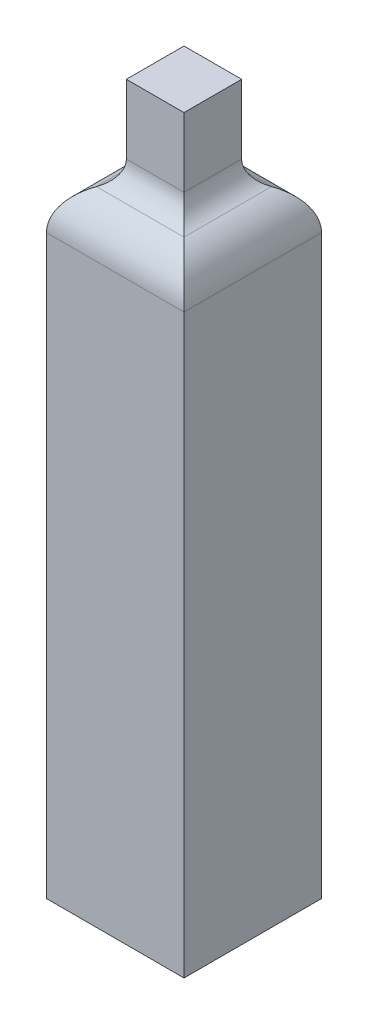
ISO-10303-21;
HEADER;
FILE_DESCRIPTION(('STEP AP214'),'2;1');
FILE_NAME('part.step','',(''),(''),'','','');
FILE_SCHEMA(('AUTOMOTIVE_DESIGN { 1 0 10303 214 1 1 1 1 }'));
ENDSEC;
DATA;
#1=APPLICATION_CONTEXT('core data for automotive mechanical design processes');
#2=APPLICATION_PROTOCOL_DEFINITION('international standard','automotive_design',2000,#1);
#3=PRODUCT_CONTEXT('',#1,'mechanical');
#4=PRODUCT('Part','Part','',(#3));
#5=PRODUCT_RELATED_PRODUCT_CATEGORY('part','',(#4));
#6=PRODUCT_DEFINITION_FORMATION('','',#4);
#7=PRODUCT_DEFINITION_CONTEXT('part definition',#1,'design');
#8=PRODUCT_DEFINITION('design','',#6,#7);
#9=PRODUCT_DEFINITION_SHAPE('','',#8);
#10=(LENGTH_UNIT() NAMED_UNIT(*) SI_UNIT(.MILLI.,.METRE.));
#11=(NAMED_UNIT(*) PLANE_ANGLE_UNIT() SI_UNIT($,.RADIAN.));
#12=(NAMED_UNIT(*) SI_UNIT($,.STERADIAN.) SOLID_ANGLE_UNIT());
#13=UNCERTAINTY_MEASURE_WITH_UNIT(LENGTH_MEASURE(1.E-05),#10,'distance_accuracy_value','');
#14=(GEOMETRIC_REPRESENTATION_CONTEXT(3) GLOBAL_UNCERTAINTY_ASSIGNED_CONTEXT((#13)) GLOBAL_UNIT_ASSIGNED_CONTEXT((#10,
#11,#12)) REPRESENTATION_CONTEXT('',''));
#15=CARTESIAN_POINT('',(0.,0.,0.));
#16=DIRECTION('',(0.,0.,1.));
#17=DIRECTION('',(1.,0.,0.));
#18=AXIS2_PLACEMENT_3D('',#15,#16,#17);
#19=CARTESIAN_POINT('',(7.75,70.,-7.75));
#20=DIRECTION('',(-1.,0.,0.));
#21=DIRECTION('',(0.,0.,1.));
#22=AXIS2_PLACEMENT_3D('',#19,#20,#21);
#23=PLANE('',#22);
#24=DIRECTION('',(0.,-1.,0.));
#25=VECTOR('',#24,1.);
#26=CARTESIAN_POINT('',(7.75,70.,-7.75));
#27=LINE('',#26,#25);
#28=CARTESIAN_POINT('',(7.75,65.0250628144669,-7.75));
#29=VERTEX_POINT('',#28);
#30=CARTESIAN_POINT('',(7.75,0.,-7.75));
#31=VERTEX_POINT('',#30);
#32=EDGE_CURVE('E160',#29,#31,#27,.T.);
#33=ORIENTED_EDGE('',*,*,#32,.F.);
#34=DIRECTION('',(0.,0.,1.));
#35=VECTOR('',#34,1.);
#36=CARTESIAN_POINT('',(7.75,65.0250628144669,-7.75));
#37=LINE('',#36,#35);
#38=CARTESIAN_POINT('',(7.75,65.0250628144669,7.75));
#39=VERTEX_POINT('',#38);
#40=EDGE_CURVE('E165',#29,#39,#37,.T.);
#41=ORIENTED_EDGE('',*,*,#40,.T.);
#42=DIRECTION('',(0.,-1.,0.));
#43=VECTOR('',#42,1.);
#44=CARTESIAN_POINT('',(7.75,70.,7.75));
#45=LINE('',#44,#43);
#46=CARTESIAN_POINT('',(7.75,0.,7.75));
#47=VERTEX_POINT('',#46);
#48=EDGE_CURVE('E154',#39,#47,#45,.T.);
#49=ORIENTED_EDGE('',*,*,#48,.T.);
#50=DIRECTION('',(0.,0.,-1.));
#51=VECTOR('',#50,1.);
#52=CARTESIAN_POINT('',(7.75,0.,-7.75));
#53=LINE('',#52,#51);
#54=EDGE_CURVE('E137',#47,#31,#53,.T.);
#55=ORIENTED_EDGE('',*,*,#54,.T.);
#56=EDGE_LOOP('',(#33,#41,#49,#55));
#57=FACE_BOUND('',#56,.T.);
#58=ADVANCED_FACE('F35',(#57),#23,.F.);
#59=CARTESIAN_POINT('',(-7.75,70.,-7.75));
#60=DIRECTION('',(0.,0.,1.));
#61=DIRECTION('',(1.,0.,0.));
#62=AXIS2_PLACEMENT_3D('',#59,#60,#61);
#63=PLANE('',#62);
#64=DIRECTION('',(0.,-1.,0.));
#65=VECTOR('',#64,1.);
#66=CARTESIAN_POINT('',(-7.75,70.,-7.75));
#67=LINE('',#66,#65);
#68=CARTESIAN_POINT('',(-7.75,65.0250628144669,-7.75));
#69=VERTEX_POINT('',#68);
#70=CARTESIAN_POINT('',(-7.75,0.,-7.75));
#71=VERTEX_POINT('',#70);
#72=EDGE_CURVE('E158',#69,#71,#67,.T.);
#73=ORIENTED_EDGE('',*,*,#72,.F.);
#74=DIRECTION('',(1.,0.,0.));
#75=VECTOR('',#74,1.);
#76=CARTESIAN_POINT('',(-7.75,65.0250628144669,-7.75));
#77=LINE('',#76,#75);
#78=EDGE_CURVE('E162',#69,#29,#77,.T.);
#79=ORIENTED_EDGE('',*,*,#78,.T.);
#80=ORIENTED_EDGE('',*,*,#32,.T.);
#81=DIRECTION('',(-1.,0.,0.));
#82=VECTOR('',#81,1.);
#83=CARTESIAN_POINT('',(-7.75,0.,-7.75));
#84=LINE('',#83,#82);
#85=EDGE_CURVE('E140',#31,#71,#84,.T.);
#86=ORIENTED_EDGE('',*,*,#85,.T.);
#87=EDGE_LOOP('',(#73,#79,#80,#86));
#88=FACE_BOUND('',#87,.T.);
#89=ADVANCED_FACE('F241',(#88),#63,.F.);
#90=CARTESIAN_POINT('',(-7.75,70.,-7.75));
#91=DIRECTION('',(1.,0.,0.));
#92=DIRECTION('',(0.,0.,-1.));
#93=AXIS2_PLACEMENT_3D('',#90,#91,#92);
#94=PLANE('',#93);
#95=DIRECTION('',(0.,-1.,0.));
#96=VECTOR('',#95,1.);
#97=CARTESIAN_POINT('',(-7.75,70.,7.75));
#98=LINE('',#97,#96);
#99=CARTESIAN_POINT('',(-7.75,65.0250628144669,7.75));
#100=VERTEX_POINT('',#99);
#101=CARTESIAN_POINT('',(-7.75,0.,7.75));
#102=VERTEX_POINT('',#101);
#103=EDGE_CURVE('E156',#100,#102,#98,.T.);
#104=ORIENTED_EDGE('',*,*,#103,.F.);
#105=DIRECTION('',(0.,0.,-1.));
#106=VECTOR('',#105,1.);
#107=CARTESIAN_POINT('',(-7.75,65.0250628144669,-7.75));
#108=LINE('',#107,#106);
#109=EDGE_CURVE('E168',#100,#69,#108,.T.);
#110=ORIENTED_EDGE('',*,*,#109,.T.);
#111=ORIENTED_EDGE('',*,*,#72,.T.);
#112=DIRECTION('',(0.,0.,1.));
#113=VECTOR('',#112,1.);
#114=CARTESIAN_POINT('',(-7.75,0.,-7.75));
#115=LINE('',#114,#113);
#116=EDGE_CURVE('E148',#71,#102,#115,.T.);
#117=ORIENTED_EDGE('',*,*,#116,.T.);
#118=EDGE_LOOP('',(#104,#110,#111,#117));
#119=FACE_BOUND('',#118,.T.);
#120=ADVANCED_FACE('F247',(#119),#94,.F.);
#121=CARTESIAN_POINT('',(-7.75,70.,7.75));
#122=DIRECTION('',(0.,0.,-1.));
#123=DIRECTION('',(-1.,0.,0.));
#124=AXIS2_PLACEMENT_3D('',#121,#122,#123);
#125=PLANE('',#124);
#126=ORIENTED_EDGE('',*,*,#48,.F.);
#127=DIRECTION('',(-1.,0.,0.));
#128=VECTOR('',#127,1.);
#129=CARTESIAN_POINT('',(-7.75,65.0250628144669,7.75));
#130=LINE('',#129,#128);
#131=EDGE_CURVE('E170',#39,#100,#130,.T.);
#132=ORIENTED_EDGE('',*,*,#131,.T.);
#133=ORIENTED_EDGE('',*,*,#103,.T.);
#134=DIRECTION('',(1.,0.,0.));
#135=VECTOR('',#134,1.);
#136=CARTESIAN_POINT('',(-7.75,0.,7.75));
#137=LINE('',#136,#135);
#138=EDGE_CURVE('E151',#102,#47,#137,.T.);
#139=ORIENTED_EDGE('',*,*,#138,.T.);
#140=EDGE_LOOP('',(#126,#132,#133,#139));
#141=FACE_BOUND('',#140,.T.);
#142=ADVANCED_FACE('F318',(#141),#125,.F.);
#143=CARTESIAN_POINT('',(0.,0.,0.));
#144=DIRECTION('',(0.,1.,0.));
#145=DIRECTION('',(0.,0.,1.));
#146=AXIS2_PLACEMENT_3D('',#143,#144,#145);
#147=PLANE('',#146);
#148=ORIENTED_EDGE('',*,*,#54,.F.);
#149=ORIENTED_EDGE('',*,*,#138,.F.);
#150=ORIENTED_EDGE('',*,*,#116,.F.);
#151=ORIENTED_EDGE('',*,*,#85,.F.);
#152=EDGE_LOOP('',(#148,#149,#150,#151));
#153=FACE_BOUND('',#152,.T.);
#154=ADVANCED_FACE('F299',(#153),#147,.F.);
#155=CARTESIAN_POINT('',(3.25,80.,-3.25));
#156=DIRECTION('',(-1.,0.,0.));
#157=DIRECTION('',(0.,0.,1.));
#158=AXIS2_PLACEMENT_3D('',#155,#156,#157);
#159=PLANE('',#158);
#160=DIRECTION('',(0.,-1.,0.));
#161=VECTOR('',#160,1.);
#162=CARTESIAN_POINT('',(3.25,80.,3.25));
#163=LINE('',#162,#161);
#164=CARTESIAN_POINT('',(3.25,80.,3.25));
#165=VERTEX_POINT('',#164);
#166=CARTESIAN_POINT('',(3.25,72.218810099436,3.25));
#167=VERTEX_POINT('',#166);
#168=EDGE_CURVE('E228',#165,#167,#163,.T.);
#169=ORIENTED_EDGE('',*,*,#168,.T.);
#170=DIRECTION('',(0.,0.,1.));
#171=VECTOR('',#170,1.);
#172=CARTESIAN_POINT('',(3.25,72.218810099436,-3.25));
#173=LINE('',#172,#171);
#174=CARTESIAN_POINT('',(3.25,72.218810099436,-3.25));
#175=VERTEX_POINT('',#174);
#176=EDGE_CURVE('E44',#167,#175,#173,.F.);
#177=ORIENTED_EDGE('',*,*,#176,.T.);
#178=DIRECTION('',(0.,-1.,0.));
#179=VECTOR('',#178,1.);
#180=CARTESIAN_POINT('',(3.25,80.,-3.25));
#181=LINE('',#180,#179);
#182=CARTESIAN_POINT('',(3.25,80.,-3.25));
#183=VERTEX_POINT('',#182);
#184=EDGE_CURVE('E119',#183,#175,#181,.T.);
#185=ORIENTED_EDGE('',*,*,#184,.F.);
#186=DIRECTION('',(0.,0.,-1.));
#187=VECTOR('',#186,1.);
#188=CARTESIAN_POINT('',(3.25,80.,-3.25));
#189=LINE('',#188,#187);
#190=EDGE_CURVE('E126',#165,#183,#189,.T.);
#191=ORIENTED_EDGE('',*,*,#190,.F.);
#192=EDGE_LOOP('',(#169,#177,#185,#191));
#193=FACE_BOUND('',#192,.T.);
#194=ADVANCED_FACE('F135',(#193),#159,.F.);
#195=CARTESIAN_POINT('',(-3.25,80.,-3.25));
#196=DIRECTION('',(0.,0.,1.));
#197=DIRECTION('',(1.,0.,0.));
#198=AXIS2_PLACEMENT_3D('',#195,#196,#197);
#199=PLANE('',#198);
#200=ORIENTED_EDGE('',*,*,#184,.T.);
#201=DIRECTION('',(1.,0.,0.));
#202=VECTOR('',#201,1.);
#203=CARTESIAN_POINT('',(-3.25,72.218810099436,-3.25));
#204=LINE('',#203,#202);
#205=CARTESIAN_POINT('',(-3.25,72.218810099436,-3.25));
#206=VERTEX_POINT('',#205);
#207=EDGE_CURVE('E187',#175,#206,#204,.F.);
#208=ORIENTED_EDGE('',*,*,#207,.T.);
#209=DIRECTION('',(0.,-1.,0.));
#210=VECTOR('',#209,1.);
#211=CARTESIAN_POINT('',(-3.25,80.,-3.25));
#212=LINE('',#211,#210);
#213=CARTESIAN_POINT('',(-3.25,80.,-3.25));
#214=VERTEX_POINT('',#213);
#215=EDGE_CURVE('E122',#214,#206,#212,.T.);
#216=ORIENTED_EDGE('',*,*,#215,.F.);
#217=DIRECTION('',(-1.,0.,0.));
#218=VECTOR('',#217,1.);
#219=CARTESIAN_POINT('',(-3.25,80.,-3.25));
#220=LINE('',#219,#218);
#221=EDGE_CURVE('E115',#183,#214,#220,.T.);
#222=ORIENTED_EDGE('',*,*,#221,.F.);
#223=EDGE_LOOP('',(#200,#208,#216,#222));
#224=FACE_BOUND('',#223,.T.);
#225=ADVANCED_FACE('F117',(#224),#199,.F.);
#226=CARTESIAN_POINT('',(-3.25,80.,-3.25));
#227=DIRECTION('',(1.,0.,0.));
#228=DIRECTION('',(0.,0.,-1.));
#229=AXIS2_PLACEMENT_3D('',#226,#227,#228);
#230=PLANE('',#229);
#231=ORIENTED_EDGE('',*,*,#215,.T.);
#232=DIRECTION('',(0.,0.,-1.));
#233=VECTOR('',#232,1.);
#234=CARTESIAN_POINT('',(-3.25,72.218810099436,-3.25));
#235=LINE('',#234,#233);
#236=CARTESIAN_POINT('',(-3.25,72.218810099436,3.25));
#237=VERTEX_POINT('',#236);
#238=EDGE_CURVE('E172',#206,#237,#235,.F.);
#239=ORIENTED_EDGE('',*,*,#238,.T.);
#240=DIRECTION('',(0.,-1.,0.));
#241=VECTOR('',#240,1.);
#242=CARTESIAN_POINT('',(-3.25,80.,3.25));
#243=LINE('',#242,#241);
#244=CARTESIAN_POINT('',(-3.25,80.,3.25));
#245=VERTEX_POINT('',#244);
#246=EDGE_CURVE('E142',#245,#237,#243,.T.);
#247=ORIENTED_EDGE('',*,*,#246,.F.);
#248=DIRECTION('',(0.,0.,1.));
#249=VECTOR('',#248,1.);
#250=CARTESIAN_POINT('',(-3.25,80.,-3.25));
#251=LINE('',#250,#249);
#252=EDGE_CURVE('E125',#214,#245,#251,.T.);
#253=ORIENTED_EDGE('',*,*,#252,.F.);
#254=EDGE_LOOP('',(#231,#239,#247,#253));
#255=FACE_BOUND('',#254,.T.);
#256=ADVANCED_FACE('F226',(#255),#230,.F.);
#257=CARTESIAN_POINT('',(-3.25,80.,3.25));
#258=DIRECTION('',(0.,0.,-1.));
#259=DIRECTION('',(-1.,0.,0.));
#260=AXIS2_PLACEMENT_3D('',#257,#258,#259);
#261=PLANE('',#260);
#262=ORIENTED_EDGE('',*,*,#246,.T.);
#263=DIRECTION('',(-1.,0.,0.));
#264=VECTOR('',#263,1.);
#265=CARTESIAN_POINT('',(-3.25,72.218810099436,3.25));
#266=LINE('',#265,#264);
#267=EDGE_CURVE('E58',#237,#167,#266,.F.);
#268=ORIENTED_EDGE('',*,*,#267,.T.);
#269=ORIENTED_EDGE('',*,*,#168,.F.);
#270=DIRECTION('',(1.,0.,0.));
#271=VECTOR('',#270,1.);
#272=CARTESIAN_POINT('',(-3.25,80.,3.25));
#273=LINE('',#272,#271);
#274=EDGE_CURVE('E131',#245,#165,#273,.T.);
#275=ORIENTED_EDGE('',*,*,#274,.F.);
#276=EDGE_LOOP('',(#262,#268,#269,#275));
#277=FACE_BOUND('',#276,.T.);
#278=ADVANCED_FACE('F227',(#277),#261,.F.);
#279=CARTESIAN_POINT('',(0.,80.,0.));
#280=DIRECTION('',(0.,1.,0.));
#281=DIRECTION('',(0.,0.,1.));
#282=AXIS2_PLACEMENT_3D('',#279,#280,#281);
#283=PLANE('',#282);
#284=ORIENTED_EDGE('',*,*,#190,.T.);
#285=ORIENTED_EDGE('',*,*,#221,.T.);
#286=ORIENTED_EDGE('',*,*,#252,.T.);
#287=ORIENTED_EDGE('',*,*,#274,.T.);
#288=EDGE_LOOP('',(#284,#285,#286,#287));
#289=FACE_BOUND('',#288,.T.);
#290=ADVANCED_FACE('F129',(#289),#283,.T.);
#291=CARTESIAN_POINT('',(0.,65.0250628144669,2.75));
#292=DIRECTION('',(-1.,0.,0.));
#293=DIRECTION('',(0.,0.,1.));
#294=AXIS2_PLACEMENT_3D('',#291,#292,#293);
#295=CYLINDRICAL_SURFACE('',#294,5.);
#296=CARTESIAN_POINT('',(2.75,65.0250628144669,2.75));
#297=DIRECTION('',(-0.707106781186547,0.,0.707106781186548));
#298=DIRECTION('',(-0.707106781186548,0.,-0.707106781186547));
#299=AXIS2_PLACEMENT_3D('',#296,#297,#298);
#300=ELLIPSE('',#299,7.07106781186548,5.);
#301=CARTESIAN_POINT('',(4.9375,69.5211548675726,4.9375));
#302=VERTEX_POINT('',#301);
#303=EDGE_CURVE('E133',#302,#39,#300,.F.);
#304=ORIENTED_EDGE('',*,*,#303,.F.);
#305=DIRECTION('',(-1.,0.,0.));
#306=VECTOR('',#305,1.);
#307=CARTESIAN_POINT('',(0.,69.5211548675726,4.9375));
#308=LINE('',#307,#306);
#309=CARTESIAN_POINT('',(-4.9375,69.5211548675726,4.9375));
#310=VERTEX_POINT('',#309);
#311=EDGE_CURVE('E192',#302,#310,#308,.T.);
#312=ORIENTED_EDGE('',*,*,#311,.T.);
#313=CARTESIAN_POINT('',(-2.75,65.0250628144669,2.75));
#314=DIRECTION('',(-0.707106781186548,0.,-0.707106781186547));
#315=DIRECTION('',(-0.707106781186547,0.,0.707106781186548));
#316=AXIS2_PLACEMENT_3D('',#313,#314,#315);
#317=ELLIPSE('',#316,7.07106781186547,5.);
#318=EDGE_CURVE('E178',#100,#310,#317,.T.);
#319=ORIENTED_EDGE('',*,*,#318,.F.);
#320=ORIENTED_EDGE('',*,*,#131,.F.);
#321=EDGE_LOOP('',(#304,#312,#319,#320));
#322=FACE_BOUND('',#321,.T.);
#323=ADVANCED_FACE('F214',(#322),#295,.T.);
#324=CARTESIAN_POINT('',(2.75,65.0250628144669,0.));
#325=DIRECTION('',(0.,0.,1.));
#326=DIRECTION('',(1.,0.,0.));
#327=AXIS2_PLACEMENT_3D('',#324,#325,#326);
#328=CYLINDRICAL_SURFACE('',#327,5.);
#329=CARTESIAN_POINT('',(2.75,65.0250628144669,-2.75));
#330=DIRECTION('',(0.707106781186548,0.,0.707106781186547));
#331=DIRECTION('',(-0.707106781186547,0.,0.707106781186548));
#332=AXIS2_PLACEMENT_3D('',#329,#330,#331);
#333=ELLIPSE('',#332,7.07106781186547,5.);
#334=CARTESIAN_POINT('',(4.9375,69.5211548675726,-4.9375));
#335=VERTEX_POINT('',#334);
#336=EDGE_CURVE('E176',#335,#29,#333,.F.);
#337=ORIENTED_EDGE('',*,*,#336,.F.);
#338=DIRECTION('',(0.,0.,1.));
#339=VECTOR('',#338,1.);
#340=CARTESIAN_POINT('',(4.9375,69.5211548675726,0.));
#341=LINE('',#340,#339);
#342=EDGE_CURVE('E11',#335,#302,#341,.T.);
#343=ORIENTED_EDGE('',*,*,#342,.T.);
#344=ORIENTED_EDGE('',*,*,#303,.T.);
#345=ORIENTED_EDGE('',*,*,#40,.F.);
#346=EDGE_LOOP('',(#337,#343,#344,#345));
#347=FACE_BOUND('',#346,.T.);
#348=ADVANCED_FACE('F259',(#347),#328,.T.);
#349=CARTESIAN_POINT('',(-2.75,65.0250628144669,0.));
#350=DIRECTION('',(0.,0.,-1.));
#351=DIRECTION('',(-1.,0.,0.));
#352=AXIS2_PLACEMENT_3D('',#349,#350,#351);
#353=CYLINDRICAL_SURFACE('',#352,5.);
#354=ORIENTED_EDGE('',*,*,#318,.T.);
#355=DIRECTION('',(0.,0.,-1.));
#356=VECTOR('',#355,1.);
#357=CARTESIAN_POINT('',(-4.9375,69.5211548675726,0.));
#358=LINE('',#357,#356);
#359=CARTESIAN_POINT('',(-4.9375,69.5211548675726,-4.9375));
#360=VERTEX_POINT('',#359);
#361=EDGE_CURVE('E184',#310,#360,#358,.T.);
#362=ORIENTED_EDGE('',*,*,#361,.T.);
#363=CARTESIAN_POINT('',(-2.75,65.0250628144669,-2.75));
#364=DIRECTION('',(0.707106781186547,0.,-0.707106781186548));
#365=DIRECTION('',(-0.707106781186548,0.,-0.707106781186547));
#366=AXIS2_PLACEMENT_3D('',#363,#364,#365);
#367=ELLIPSE('',#366,7.07106781186548,5.);
#368=EDGE_CURVE('E173',#69,#360,#367,.T.);
#369=ORIENTED_EDGE('',*,*,#368,.F.);
#370=ORIENTED_EDGE('',*,*,#109,.F.);
#371=EDGE_LOOP('',(#354,#362,#369,#370));
#372=FACE_BOUND('',#371,.T.);
#373=ADVANCED_FACE('F219',(#372),#353,.T.);
#374=CARTESIAN_POINT('',(0.,65.0250628144669,-2.75));
#375=DIRECTION('',(1.,0.,0.));
#376=DIRECTION('',(0.,0.,-1.));
#377=AXIS2_PLACEMENT_3D('',#374,#375,#376);
#378=CYLINDRICAL_SURFACE('',#377,5.);
#379=ORIENTED_EDGE('',*,*,#368,.T.);
#380=DIRECTION('',(1.,0.,0.));
#381=VECTOR('',#380,1.);
#382=CARTESIAN_POINT('',(0.,69.5211548675726,-4.9375));
#383=LINE('',#382,#381);
#384=EDGE_CURVE('E189',#360,#335,#383,.T.);
#385=ORIENTED_EDGE('',*,*,#384,.T.);
#386=ORIENTED_EDGE('',*,*,#336,.T.);
#387=ORIENTED_EDGE('',*,*,#78,.F.);
#388=EDGE_LOOP('',(#379,#385,#386,#387));
#389=FACE_BOUND('',#388,.T.);
#390=ADVANCED_FACE('F253',(#389),#378,.T.);
#391=CARTESIAN_POINT('',(6.25,72.218810099436,0.));
#392=DIRECTION('',(0.,0.,1.));
#393=DIRECTION('',(1.,0.,0.));
#394=AXIS2_PLACEMENT_3D('',#391,#392,#393);
#395=CYLINDRICAL_SURFACE('',#394,3.);
#396=CARTESIAN_POINT('',(6.25,72.218810099436,6.25));
#397=DIRECTION('',(-0.707106781186547,0.,0.707106781186548));
#398=DIRECTION('',(0.707106781186548,0.,0.707106781186547));
#399=AXIS2_PLACEMENT_3D('',#396,#397,#398);
#400=ELLIPSE('',#399,4.24264068711929,3.);
#401=EDGE_CURVE('E198',#302,#167,#400,.F.);
#402=ORIENTED_EDGE('',*,*,#401,.F.);
#403=ORIENTED_EDGE('',*,*,#342,.F.);
#404=CARTESIAN_POINT('',(6.25,72.218810099436,-6.25));
#405=DIRECTION('',(0.707106781186548,0.,0.707106781186547));
#406=DIRECTION('',(-0.707106781186547,0.,0.707106781186548));
#407=AXIS2_PLACEMENT_3D('',#404,#405,#406);
#408=ELLIPSE('',#407,4.24264068711928,3.);
#409=EDGE_CURVE('E39',#175,#335,#408,.T.);
#410=ORIENTED_EDGE('',*,*,#409,.F.);
#411=ORIENTED_EDGE('',*,*,#176,.F.);
#412=EDGE_LOOP('',(#402,#403,#410,#411));
#413=FACE_BOUND('',#412,.T.);
#414=ADVANCED_FACE('F37',(#413),#395,.F.);
#415=CARTESIAN_POINT('',(0.,72.218810099436,-6.25));
#416=DIRECTION('',(1.,0.,0.));
#417=DIRECTION('',(0.,0.,-1.));
#418=AXIS2_PLACEMENT_3D('',#415,#416,#417);
#419=CYLINDRICAL_SURFACE('',#418,3.);
#420=ORIENTED_EDGE('',*,*,#409,.T.);
#421=ORIENTED_EDGE('',*,*,#384,.F.);
#422=CARTESIAN_POINT('',(-6.25,72.218810099436,-6.25));
#423=DIRECTION('',(0.707106781186547,0.,-0.707106781186548));
#424=DIRECTION('',(0.707106781186548,0.,0.707106781186547));
#425=AXIS2_PLACEMENT_3D('',#422,#423,#424);
#426=ELLIPSE('',#425,4.24264068711929,3.);
#427=EDGE_CURVE('E197',#206,#360,#426,.T.);
#428=ORIENTED_EDGE('',*,*,#427,.F.);
#429=ORIENTED_EDGE('',*,*,#207,.F.);
#430=EDGE_LOOP('',(#420,#421,#428,#429));
#431=FACE_BOUND('',#430,.T.);
#432=ADVANCED_FACE('F207',(#431),#419,.F.);
#433=CARTESIAN_POINT('',(0.,72.218810099436,6.25));
#434=DIRECTION('',(-1.,0.,0.));
#435=DIRECTION('',(0.,0.,1.));
#436=AXIS2_PLACEMENT_3D('',#433,#434,#435);
#437=CYLINDRICAL_SURFACE('',#436,3.);
#438=ORIENTED_EDGE('',*,*,#401,.T.);
#439=ORIENTED_EDGE('',*,*,#267,.F.);
#440=CARTESIAN_POINT('',(-6.25,72.218810099436,6.25));
#441=DIRECTION('',(-0.707106781186548,0.,-0.707106781186547));
#442=DIRECTION('',(-0.707106781186547,0.,0.707106781186548));
#443=AXIS2_PLACEMENT_3D('',#440,#441,#442);
#444=ELLIPSE('',#443,4.24264068711928,3.);
#445=EDGE_CURVE('E195',#310,#237,#444,.F.);
#446=ORIENTED_EDGE('',*,*,#445,.F.);
#447=ORIENTED_EDGE('',*,*,#311,.F.);
#448=EDGE_LOOP('',(#438,#439,#446,#447));
#449=FACE_BOUND('',#448,.T.);
#450=ADVANCED_FACE('F211',(#449),#437,.F.);
#451=CARTESIAN_POINT('',(-6.25,72.218810099436,0.));
#452=DIRECTION('',(0.,0.,-1.));
#453=DIRECTION('',(-1.,0.,0.));
#454=AXIS2_PLACEMENT_3D('',#451,#452,#453);
#455=CYLINDRICAL_SURFACE('',#454,3.);
#456=ORIENTED_EDGE('',*,*,#427,.T.);
#457=ORIENTED_EDGE('',*,*,#361,.F.);
#458=ORIENTED_EDGE('',*,*,#445,.T.);
#459=ORIENTED_EDGE('',*,*,#238,.F.);
#460=EDGE_LOOP('',(#456,#457,#458,#459));
#461=FACE_BOUND('',#460,.T.);
#462=ADVANCED_FACE('F222',(#461),#455,.F.);
#463=CLOSED_SHELL('',(#58,#89,#120,#142,#154,#194,#225,#256,#278,#290,#323,#348,#373,#390,#414,
#432,#450,#462));
#464=MANIFOLD_SOLID_BREP('B2',#463);
#465=ADVANCED_BREP_SHAPE_REPRESENTATION('',(#18,#464),#14);
#466=SHAPE_DEFINITION_REPRESENTATION(#9,#465);
ENDSEC;
END-ISO-10303-21;
